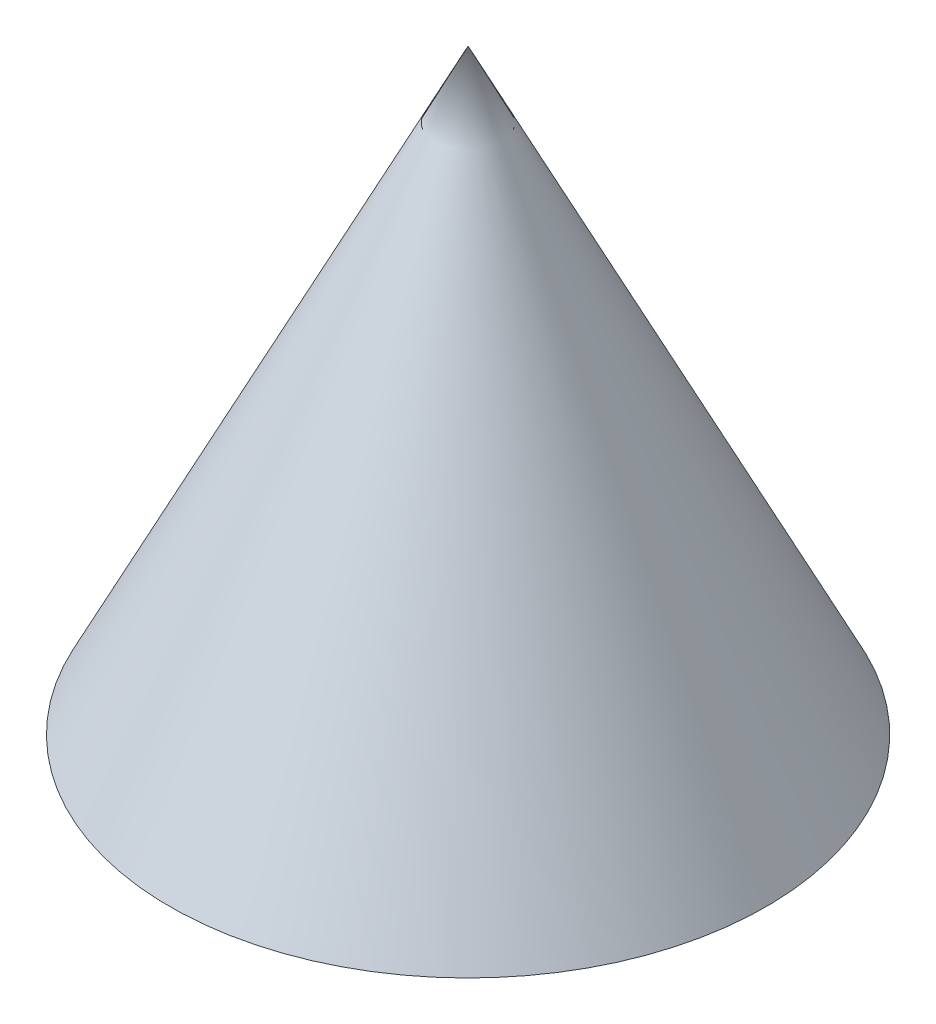
ISO-10303-21;
HEADER;
FILE_DESCRIPTION(('STEP AP214'),'2;1');
FILE_NAME('part.step','',(''),(''),'','','');
FILE_SCHEMA(('AUTOMOTIVE_DESIGN { 1 0 10303 214 1 1 1 1 }'));
ENDSEC;
DATA;
#1=APPLICATION_CONTEXT('core data for automotive mechanical design processes');
#2=APPLICATION_PROTOCOL_DEFINITION('international standard','automotive_design',2000,#1);
#3=PRODUCT_CONTEXT('',#1,'mechanical');
#4=PRODUCT('Part','Part','',(#3));
#5=PRODUCT_RELATED_PRODUCT_CATEGORY('part','',(#4));
#6=PRODUCT_DEFINITION_FORMATION('','',#4);
#7=PRODUCT_DEFINITION_CONTEXT('part definition',#1,'design');
#8=PRODUCT_DEFINITION('design','',#6,#7);
#9=PRODUCT_DEFINITION_SHAPE('','',#8);
#10=(LENGTH_UNIT() NAMED_UNIT(*) SI_UNIT(.MILLI.,.METRE.));
#11=(NAMED_UNIT(*) PLANE_ANGLE_UNIT() SI_UNIT($,.RADIAN.));
#12=(NAMED_UNIT(*) SI_UNIT($,.STERADIAN.) SOLID_ANGLE_UNIT());
#13=UNCERTAINTY_MEASURE_WITH_UNIT(LENGTH_MEASURE(1.E-05),#10,'distance_accuracy_value','');
#14=(GEOMETRIC_REPRESENTATION_CONTEXT(3) GLOBAL_UNCERTAINTY_ASSIGNED_CONTEXT((#13)) GLOBAL_UNIT_ASSIGNED_CONTEXT((#10,
#11,#12)) REPRESENTATION_CONTEXT('',''));
#15=CARTESIAN_POINT('',(0.,0.,0.));
#16=DIRECTION('',(0.,0.,1.));
#17=DIRECTION('',(1.,0.,0.));
#18=AXIS2_PLACEMENT_3D('',#15,#16,#17);
#19=CARTESIAN_POINT('',(0.,0.,0.));
#20=DIRECTION('',(0.,-1.,0.));
#21=DIRECTION('',(0.,0.,-1.));
#22=AXIS2_PLACEMENT_3D('',#19,#20,#21);
#23=PLANE('',#22);
#24=CARTESIAN_POINT('',(0.,0.,0.));
#25=DIRECTION('',(0.,-1.,0.));
#26=DIRECTION('',(0.,0.,-1.));
#27=AXIS2_PLACEMENT_3D('',#24,#25,#26);
#28=CIRCLE('',#27,100.);
#29=CARTESIAN_POINT('',(0.,0.,-100.));
#30=VERTEX_POINT('',#29);
#31=EDGE_CURVE('E11',#30,#30,#28,.T.);
#32=ORIENTED_EDGE('',*,*,#31,.T.);
#33=EDGE_LOOP('',(#32));
#34=FACE_BOUND('',#33,.T.);
#35=ADVANCED_FACE('F41',(#34),#23,.T.);
#36=CARTESIAN_POINT('',(0.,0.,0.));
#37=DIRECTION('',(0.,-1.,0.));
#38=DIRECTION('',(0.,0.,-1.));
#39=AXIS2_PLACEMENT_3D('',#36,#37,#38);
#40=CONICAL_SURFACE('',#39,100.,0.463647609000806);
#41=CARTESIAN_POINT('',(0.,200.,0.));
#42=VERTEX_POINT('',#41);
#43=VERTEX_LOOP('',#42);
#44=FACE_BOUND('',#43,.T.);
#45=ORIENTED_EDGE('',*,*,#31,.F.);
#46=EDGE_LOOP('',(#45));
#47=FACE_BOUND('',#46,.T.);
#48=ADVANCED_FACE('F48',(#44,#47),#40,.T.);
#49=CLOSED_SHELL('',(#35,#48));
#50=MANIFOLD_SOLID_BREP('B2',#49);
#51=ADVANCED_BREP_SHAPE_REPRESENTATION('',(#18,#50),#14);
#52=SHAPE_DEFINITION_REPRESENTATION(#9,#51);
ENDSEC;
END-ISO-10303-21;
